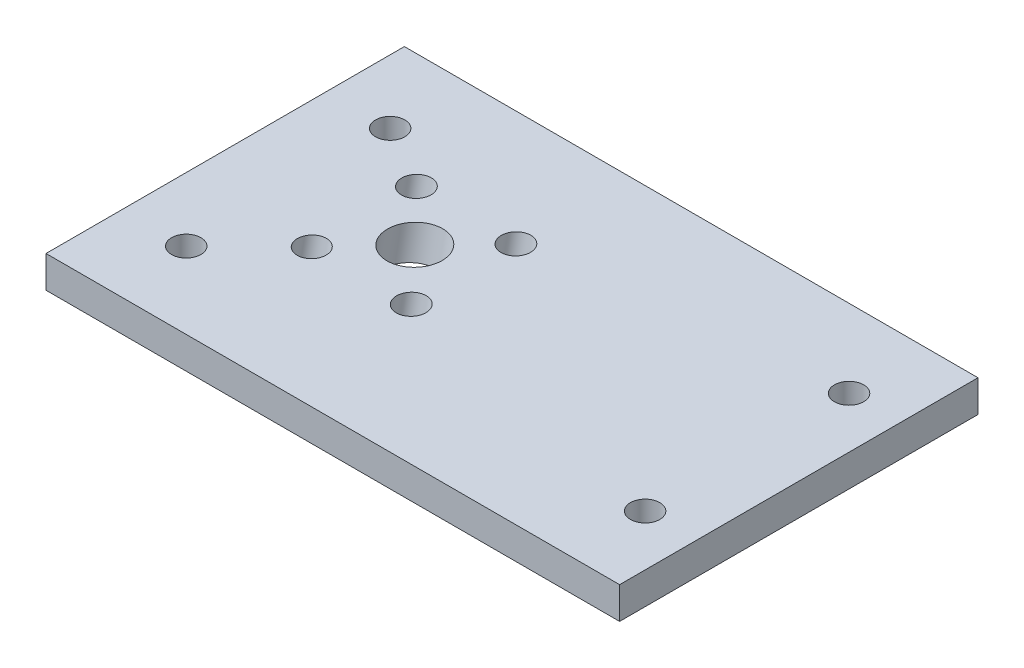
ISO-10303-21;
HEADER;
FILE_DESCRIPTION(('STEP AP214'),'2;1');
FILE_NAME('part.step','',(''),(''),'','','');
FILE_SCHEMA(('AUTOMOTIVE_DESIGN { 1 0 10303 214 1 1 1 1 }'));
ENDSEC;
DATA;
#1=APPLICATION_CONTEXT('core data for automotive mechanical design processes');
#2=APPLICATION_PROTOCOL_DEFINITION('international standard','automotive_design',2000,#1);
#3=PRODUCT_CONTEXT('',#1,'mechanical');
#4=PRODUCT('Part','Part','',(#3));
#5=PRODUCT_RELATED_PRODUCT_CATEGORY('part','',(#4));
#6=PRODUCT_DEFINITION_FORMATION('','',#4);
#7=PRODUCT_DEFINITION_CONTEXT('part definition',#1,'design');
#8=PRODUCT_DEFINITION('design','',#6,#7);
#9=PRODUCT_DEFINITION_SHAPE('','',#8);
#10=(LENGTH_UNIT() NAMED_UNIT(*) SI_UNIT(.MILLI.,.METRE.));
#11=(NAMED_UNIT(*) PLANE_ANGLE_UNIT() SI_UNIT($,.RADIAN.));
#12=(NAMED_UNIT(*) SI_UNIT($,.STERADIAN.) SOLID_ANGLE_UNIT());
#13=UNCERTAINTY_MEASURE_WITH_UNIT(LENGTH_MEASURE(1.E-05),#10,'distance_accuracy_value','');
#14=(GEOMETRIC_REPRESENTATION_CONTEXT(3) GLOBAL_UNCERTAINTY_ASSIGNED_CONTEXT((#13)) GLOBAL_UNIT_ASSIGNED_CONTEXT((#10,
#11,#12)) REPRESENTATION_CONTEXT('',''));
#15=CARTESIAN_POINT('',(0.,0.,0.));
#16=DIRECTION('',(0.,0.,1.));
#17=DIRECTION('',(1.,0.,0.));
#18=AXIS2_PLACEMENT_3D('',#15,#16,#17);
#19=CARTESIAN_POINT('',(0.,5.,0.));
#20=DIRECTION('',(1.,0.,0.));
#21=DIRECTION('',(0.,0.,-1.));
#22=AXIS2_PLACEMENT_3D('',#19,#20,#21);
#23=PLANE('',#22);
#24=DIRECTION('',(0.,0.,1.));
#25=VECTOR('',#24,1.);
#26=CARTESIAN_POINT('',(0.,0.,0.));
#27=LINE('',#26,#25);
#28=CARTESIAN_POINT('',(0.,0.,-56.23));
#29=VERTEX_POINT('',#28);
#30=CARTESIAN_POINT('',(0.,0.,0.));
#31=VERTEX_POINT('',#30);
#32=EDGE_CURVE('E99',#29,#31,#27,.T.);
#33=ORIENTED_EDGE('',*,*,#32,.T.);
#34=DIRECTION('',(0.,-1.,0.));
#35=VECTOR('',#34,1.);
#36=CARTESIAN_POINT('',(0.,5.,0.));
#37=LINE('',#36,#35);
#38=CARTESIAN_POINT('',(0.,5.,0.));
#39=VERTEX_POINT('',#38);
#40=EDGE_CURVE('E11',#39,#31,#37,.T.);
#41=ORIENTED_EDGE('',*,*,#40,.F.);
#42=DIRECTION('',(0.,0.,1.));
#43=VECTOR('',#42,1.);
#44=CARTESIAN_POINT('',(0.,5.,0.));
#45=LINE('',#44,#43);
#46=CARTESIAN_POINT('',(0.,5.,-56.23));
#47=VERTEX_POINT('',#46);
#48=EDGE_CURVE('E86',#47,#39,#45,.T.);
#49=ORIENTED_EDGE('',*,*,#48,.F.);
#50=DIRECTION('',(0.,-1.,0.));
#51=VECTOR('',#50,1.);
#52=CARTESIAN_POINT('',(0.,5.,-56.23));
#53=LINE('',#52,#51);
#54=EDGE_CURVE('E95',#47,#29,#53,.T.);
#55=ORIENTED_EDGE('',*,*,#54,.T.);
#56=EDGE_LOOP('',(#33,#41,#49,#55));
#57=FACE_BOUND('',#56,.T.);
#58=ADVANCED_FACE('F33',(#57),#23,.F.);
#59=CARTESIAN_POINT('',(0.,5.,0.));
#60=DIRECTION('',(0.,0.,-1.));
#61=DIRECTION('',(-1.,0.,0.));
#62=AXIS2_PLACEMENT_3D('',#59,#60,#61);
#63=PLANE('',#62);
#64=DIRECTION('',(1.,0.,0.));
#65=VECTOR('',#64,1.);
#66=CARTESIAN_POINT('',(0.,0.,0.));
#67=LINE('',#66,#65);
#68=CARTESIAN_POINT('',(90.,0.,0.));
#69=VERTEX_POINT('',#68);
#70=EDGE_CURVE('E90',#31,#69,#67,.T.);
#71=ORIENTED_EDGE('',*,*,#70,.T.);
#72=DIRECTION('',(0.,-1.,0.));
#73=VECTOR('',#72,1.);
#74=CARTESIAN_POINT('',(90.,5.,0.));
#75=LINE('',#74,#73);
#76=CARTESIAN_POINT('',(90.,5.,0.));
#77=VERTEX_POINT('',#76);
#78=EDGE_CURVE('E42',#77,#69,#75,.T.);
#79=ORIENTED_EDGE('',*,*,#78,.F.);
#80=DIRECTION('',(1.,0.,0.));
#81=VECTOR('',#80,1.);
#82=CARTESIAN_POINT('',(0.,5.,0.));
#83=LINE('',#82,#81);
#84=EDGE_CURVE('E81',#39,#77,#83,.T.);
#85=ORIENTED_EDGE('',*,*,#84,.F.);
#86=ORIENTED_EDGE('',*,*,#40,.T.);
#87=EDGE_LOOP('',(#71,#79,#85,#86));
#88=FACE_BOUND('',#87,.T.);
#89=ADVANCED_FACE('F89',(#88),#63,.F.);
#90=CARTESIAN_POINT('',(90.,5.,0.));
#91=DIRECTION('',(-1.,0.,0.));
#92=DIRECTION('',(0.,0.,1.));
#93=AXIS2_PLACEMENT_3D('',#90,#91,#92);
#94=PLANE('',#93);
#95=DIRECTION('',(0.,0.,-1.));
#96=VECTOR('',#95,1.);
#97=CARTESIAN_POINT('',(90.,0.,0.));
#98=LINE('',#97,#96);
#99=CARTESIAN_POINT('',(90.,0.,-56.23));
#100=VERTEX_POINT('',#99);
#101=EDGE_CURVE('E68',#69,#100,#98,.T.);
#102=ORIENTED_EDGE('',*,*,#101,.T.);
#103=DIRECTION('',(0.,-1.,0.));
#104=VECTOR('',#103,1.);
#105=CARTESIAN_POINT('',(90.,5.,-56.23));
#106=LINE('',#105,#104);
#107=CARTESIAN_POINT('',(90.,5.,-56.23));
#108=VERTEX_POINT('',#107);
#109=EDGE_CURVE('E91',#108,#100,#106,.T.);
#110=ORIENTED_EDGE('',*,*,#109,.F.);
#111=DIRECTION('',(0.,0.,-1.));
#112=VECTOR('',#111,1.);
#113=CARTESIAN_POINT('',(90.,5.,0.));
#114=LINE('',#113,#112);
#115=EDGE_CURVE('E84',#77,#108,#114,.T.);
#116=ORIENTED_EDGE('',*,*,#115,.F.);
#117=ORIENTED_EDGE('',*,*,#78,.T.);
#118=EDGE_LOOP('',(#102,#110,#116,#117));
#119=FACE_BOUND('',#118,.T.);
#120=ADVANCED_FACE('F93',(#119),#94,.F.);
#121=CARTESIAN_POINT('',(0.,5.,-56.23));
#122=DIRECTION('',(0.,0.,1.));
#123=DIRECTION('',(1.,0.,0.));
#124=AXIS2_PLACEMENT_3D('',#121,#122,#123);
#125=PLANE('',#124);
#126=DIRECTION('',(-1.,0.,0.));
#127=VECTOR('',#126,1.);
#128=CARTESIAN_POINT('',(0.,0.,-56.23));
#129=LINE('',#128,#127);
#130=EDGE_CURVE('E74',#100,#29,#129,.T.);
#131=ORIENTED_EDGE('',*,*,#130,.T.);
#132=ORIENTED_EDGE('',*,*,#54,.F.);
#133=DIRECTION('',(-1.,0.,0.));
#134=VECTOR('',#133,1.);
#135=CARTESIAN_POINT('',(0.,5.,-56.23));
#136=LINE('',#135,#134);
#137=EDGE_CURVE('E51',#108,#47,#136,.T.);
#138=ORIENTED_EDGE('',*,*,#137,.F.);
#139=ORIENTED_EDGE('',*,*,#109,.T.);
#140=EDGE_LOOP('',(#131,#132,#138,#139));
#141=FACE_BOUND('',#140,.T.);
#142=ADVANCED_FACE('F164',(#141),#125,.F.);
#143=CARTESIAN_POINT('',(0.,5.,0.));
#144=DIRECTION('',(0.,-1.,0.));
#145=DIRECTION('',(0.,0.,-1.));
#146=AXIS2_PLACEMENT_3D('',#143,#144,#145);
#147=PLANE('',#146);
#148=CARTESIAN_POINT('',(27.7526194802546,5.,-30.1125349533038));
#149=DIRECTION('',(0.,-1.,0.));
#150=DIRECTION('',(0.,0.,-1.));
#151=AXIS2_PLACEMENT_3D('',#148,#149,#150);
#152=ELLIPSE('',#151,4.36752722835537,4.28728345180147);
#153=CARTESIAN_POINT('',(27.7526194802546,5.,-34.4800621816592));
#154=VERTEX_POINT('',#153);
#155=EDGE_CURVE('E147',#154,#154,#152,.T.);
#156=ORIENTED_EDGE('',*,*,#155,.T.);
#157=EDGE_LOOP('',(#156));
#158=FACE_BOUND('',#157,.T.);
#159=CARTESIAN_POINT('',(19.9454822574572,5.,-38.1677608669548));
#160=DIRECTION('',(0.,-1.,0.));
#161=DIRECTION('',(0.,0.,-1.));
#162=AXIS2_PLACEMENT_3D('',#159,#160,#161);
#163=ELLIPSE('',#162,2.34304839839699,2.3);
#164=CARTESIAN_POINT('',(19.9454822574572,5.,-40.5108092653518));
#165=VERTEX_POINT('',#164);
#166=EDGE_CURVE('E135',#165,#165,#163,.T.);
#167=ORIENTED_EDGE('',*,*,#166,.T.);
#168=EDGE_LOOP('',(#167));
#169=FACE_BOUND('',#168,.T.);
#170=CARTESIAN_POINT('',(35.5597567030519,5.,-38.1677608669548));
#171=DIRECTION('',(0.,-1.,0.));
#172=DIRECTION('',(0.,0.,-1.));
#173=AXIS2_PLACEMENT_3D('',#170,#171,#172);
#174=ELLIPSE('',#173,2.343048398397,2.3);
#175=CARTESIAN_POINT('',(35.5597567030519,5.,-40.5108092653518));
#176=VERTEX_POINT('',#175);
#177=EDGE_CURVE('E132',#176,#176,#174,.T.);
#178=ORIENTED_EDGE('',*,*,#177,.T.);
#179=EDGE_LOOP('',(#178));
#180=FACE_BOUND('',#179,.T.);
#181=CARTESIAN_POINT('',(35.5597567030519,5.,-21.7514143847097));
#182=DIRECTION('',(0.,-1.,0.));
#183=DIRECTION('',(0.,0.,-1.));
#184=AXIS2_PLACEMENT_3D('',#181,#182,#183);
#185=ELLIPSE('',#184,2.343048398397,2.30000000000001);
#186=CARTESIAN_POINT('',(35.5597567030519,5.,-24.0944627831067));
#187=VERTEX_POINT('',#186);
#188=EDGE_CURVE('E129',#187,#187,#185,.T.);
#189=ORIENTED_EDGE('',*,*,#188,.T.);
#190=EDGE_LOOP('',(#189));
#191=FACE_BOUND('',#190,.T.);
#192=CARTESIAN_POINT('',(19.9454822574572,5.,-21.7514143847097));
#193=DIRECTION('',(0.,-1.,0.));
#194=DIRECTION('',(0.,0.,-1.));
#195=AXIS2_PLACEMENT_3D('',#192,#193,#194);
#196=ELLIPSE('',#195,2.3,2.25774252192963);
#197=CARTESIAN_POINT('',(19.9454822574572,5.,-24.0514143847097));
#198=VERTEX_POINT('',#197);
#199=EDGE_CURVE('E125',#198,#198,#196,.T.);
#200=ORIENTED_EDGE('',*,*,#199,.T.);
#201=EDGE_LOOP('',(#200));
#202=FACE_BOUND('',#201,.T.);
#203=CARTESIAN_POINT('',(82.0000000000904,5.,-44.0000000000535));
#204=DIRECTION('',(0.,1.,0.));
#205=DIRECTION('',(0.,0.,1.));
#206=AXIS2_PLACEMENT_3D('',#203,#204,#205);
#207=CIRCLE('',#206,2.29999999990055);
#208=CARTESIAN_POINT('',(82.0000000000904,5.,-41.7000000001529));
#209=VERTEX_POINT('',#208);
#210=EDGE_CURVE('E118',#209,#209,#207,.T.);
#211=ORIENTED_EDGE('',*,*,#210,.F.);
#212=EDGE_LOOP('',(#211));
#213=FACE_BOUND('',#212,.T.);
#214=CARTESIAN_POINT('',(10.0000000000904,5.,-44.0000000000537));
#215=DIRECTION('',(0.,1.,0.));
#216=DIRECTION('',(0.,0.,1.));
#217=AXIS2_PLACEMENT_3D('',#214,#215,#216);
#218=CIRCLE('',#217,2.29999999990054);
#219=CARTESIAN_POINT('',(10.0000000000904,5.,-41.7000000001532));
#220=VERTEX_POINT('',#219);
#221=EDGE_CURVE('E150',#220,#220,#218,.T.);
#222=ORIENTED_EDGE('',*,*,#221,.F.);
#223=EDGE_LOOP('',(#222));
#224=FACE_BOUND('',#223,.T.);
#225=CARTESIAN_POINT('',(82.0000000000023,5.,-12.0000000000011));
#226=DIRECTION('',(0.,1.,0.));
#227=DIRECTION('',(0.,0.,1.));
#228=AXIS2_PLACEMENT_3D('',#225,#226,#227);
#229=CIRCLE('',#228,2.29999999999999);
#230=CARTESIAN_POINT('',(82.0000000000023,5.,-9.70000000000109));
#231=VERTEX_POINT('',#230);
#232=EDGE_CURVE('E111',#231,#231,#229,.T.);
#233=ORIENTED_EDGE('',*,*,#232,.F.);
#234=EDGE_LOOP('',(#233));
#235=FACE_BOUND('',#234,.T.);
#236=CARTESIAN_POINT('',(10.0000000000023,5.,-12.0000000000013));
#237=DIRECTION('',(0.,1.,0.));
#238=DIRECTION('',(0.,0.,1.));
#239=AXIS2_PLACEMENT_3D('',#236,#237,#238);
#240=CIRCLE('',#239,2.3);
#241=CARTESIAN_POINT('',(10.0000000000023,5.,-9.70000000000134));
#242=VERTEX_POINT('',#241);
#243=EDGE_CURVE('E121',#242,#242,#240,.T.);
#244=ORIENTED_EDGE('',*,*,#243,.F.);
#245=EDGE_LOOP('',(#244));
#246=FACE_BOUND('',#245,.T.);
#247=ORIENTED_EDGE('',*,*,#48,.T.);
#248=ORIENTED_EDGE('',*,*,#84,.T.);
#249=ORIENTED_EDGE('',*,*,#115,.T.);
#250=ORIENTED_EDGE('',*,*,#137,.T.);
#251=EDGE_LOOP('',(#247,#248,#249,#250));
#252=FACE_BOUND('',#251,.T.);
#253=ADVANCED_FACE('F82',(#158,#169,#180,#191,#202,#213,#224,#235,#246,#252),#147,.F.);
#254=CARTESIAN_POINT('',(0.,0.,0.));
#255=DIRECTION('',(0.,-1.,0.));
#256=DIRECTION('',(0.,0.,-1.));
#257=AXIS2_PLACEMENT_3D('',#254,#255,#256);
#258=PLANE('',#257);
#259=CARTESIAN_POINT('',(27.7526194802546,0.,-29.1406334076152));
#260=DIRECTION('',(0.,-1.,0.));
#261=DIRECTION('',(0.,0.,-1.));
#262=AXIS2_PLACEMENT_3D('',#259,#260,#261);
#263=ELLIPSE('',#262,4.36752722835537,4.28728345180147);
#264=CARTESIAN_POINT('',(27.7526194802546,0.,-33.5081606359706));
#265=VERTEX_POINT('',#264);
#266=EDGE_CURVE('E36',#265,#265,#263,.T.);
#267=ORIENTED_EDGE('',*,*,#266,.F.);
#268=EDGE_LOOP('',(#267));
#269=FACE_BOUND('',#268,.T.);
#270=CARTESIAN_POINT('',(19.9454822574572,0.,-37.1958593212662));
#271=DIRECTION('',(0.,-1.,0.));
#272=DIRECTION('',(0.,0.,-1.));
#273=AXIS2_PLACEMENT_3D('',#270,#271,#272);
#274=ELLIPSE('',#273,2.34304839839699,2.3);
#275=CARTESIAN_POINT('',(19.9454822574572,0.,-39.5389077196632));
#276=VERTEX_POINT('',#275);
#277=EDGE_CURVE('E133',#276,#276,#274,.T.);
#278=ORIENTED_EDGE('',*,*,#277,.F.);
#279=EDGE_LOOP('',(#278));
#280=FACE_BOUND('',#279,.T.);
#281=CARTESIAN_POINT('',(35.5597567030519,0.,-37.1958593212662));
#282=DIRECTION('',(0.,-1.,0.));
#283=DIRECTION('',(0.,0.,-1.));
#284=AXIS2_PLACEMENT_3D('',#281,#282,#283);
#285=ELLIPSE('',#284,2.343048398397,2.3);
#286=CARTESIAN_POINT('',(35.5597567030519,0.,-39.5389077196632));
#287=VERTEX_POINT('',#286);
#288=EDGE_CURVE('E130',#287,#287,#285,.T.);
#289=ORIENTED_EDGE('',*,*,#288,.F.);
#290=EDGE_LOOP('',(#289));
#291=FACE_BOUND('',#290,.T.);
#292=CARTESIAN_POINT('',(35.5597567030519,0.,-20.7795128390211));
#293=DIRECTION('',(0.,-1.,0.));
#294=DIRECTION('',(0.,0.,-1.));
#295=AXIS2_PLACEMENT_3D('',#292,#293,#294);
#296=ELLIPSE('',#295,2.343048398397,2.30000000000001);
#297=CARTESIAN_POINT('',(35.5597567030519,0.,-23.1225612374181));
#298=VERTEX_POINT('',#297);
#299=EDGE_CURVE('E126',#298,#298,#296,.T.);
#300=ORIENTED_EDGE('',*,*,#299,.F.);
#301=EDGE_LOOP('',(#300));
#302=FACE_BOUND('',#301,.T.);
#303=CARTESIAN_POINT('',(19.9454822574572,0.,-20.7795128390211));
#304=DIRECTION('',(0.,-1.,0.));
#305=DIRECTION('',(0.,0.,-1.));
#306=AXIS2_PLACEMENT_3D('',#303,#304,#305);
#307=ELLIPSE('',#306,2.3,2.25774252192963);
#308=CARTESIAN_POINT('',(19.9454822574572,0.,-23.0795128390211));
#309=VERTEX_POINT('',#308);
#310=EDGE_CURVE('E122',#309,#309,#307,.T.);
#311=ORIENTED_EDGE('',*,*,#310,.F.);
#312=EDGE_LOOP('',(#311));
#313=FACE_BOUND('',#312,.T.);
#314=CARTESIAN_POINT('',(82.0000000000904,0.,-44.0000000000535));
#315=DIRECTION('',(0.,-1.,0.));
#316=DIRECTION('',(0.,0.,-1.));
#317=AXIS2_PLACEMENT_3D('',#314,#315,#316);
#318=CIRCLE('',#317,2.29999999990055);
#319=CARTESIAN_POINT('',(82.0000000000904,0.,-41.7000000001529));
#320=VERTEX_POINT('',#319);
#321=EDGE_CURVE('E117',#320,#320,#318,.T.);
#322=ORIENTED_EDGE('',*,*,#321,.F.);
#323=EDGE_LOOP('',(#322));
#324=FACE_BOUND('',#323,.T.);
#325=CARTESIAN_POINT('',(10.0000000000904,0.,-44.0000000000537));
#326=DIRECTION('',(0.,-1.,0.));
#327=DIRECTION('',(0.,0.,-1.));
#328=AXIS2_PLACEMENT_3D('',#325,#326,#327);
#329=CIRCLE('',#328,2.29999999990054);
#330=CARTESIAN_POINT('',(10.0000000000904,0.,-41.7000000001532));
#331=VERTEX_POINT('',#330);
#332=EDGE_CURVE('E114',#331,#331,#329,.T.);
#333=ORIENTED_EDGE('',*,*,#332,.F.);
#334=EDGE_LOOP('',(#333));
#335=FACE_BOUND('',#334,.T.);
#336=CARTESIAN_POINT('',(82.0000000000023,0.,-12.0000000000011));
#337=DIRECTION('',(0.,-1.,0.));
#338=DIRECTION('',(0.,0.,-1.));
#339=AXIS2_PLACEMENT_3D('',#336,#337,#338);
#340=CIRCLE('',#339,2.29999999999999);
#341=CARTESIAN_POINT('',(82.0000000000023,0.,-9.70000000000109));
#342=VERTEX_POINT('',#341);
#343=EDGE_CURVE('E102',#342,#342,#340,.T.);
#344=ORIENTED_EDGE('',*,*,#343,.F.);
#345=EDGE_LOOP('',(#344));
#346=FACE_BOUND('',#345,.T.);
#347=CARTESIAN_POINT('',(10.0000000000023,0.,-12.0000000000013));
#348=DIRECTION('',(0.,-1.,0.));
#349=DIRECTION('',(0.,0.,-1.));
#350=AXIS2_PLACEMENT_3D('',#347,#348,#349);
#351=CIRCLE('',#350,2.3);
#352=CARTESIAN_POINT('',(10.0000000000023,0.,-9.70000000000134));
#353=VERTEX_POINT('',#352);
#354=EDGE_CURVE('E108',#353,#353,#351,.T.);
#355=ORIENTED_EDGE('',*,*,#354,.F.);
#356=EDGE_LOOP('',(#355));
#357=FACE_BOUND('',#356,.T.);
#358=ORIENTED_EDGE('',*,*,#32,.F.);
#359=ORIENTED_EDGE('',*,*,#130,.F.);
#360=ORIENTED_EDGE('',*,*,#101,.F.);
#361=ORIENTED_EDGE('',*,*,#70,.F.);
#362=EDGE_LOOP('',(#358,#359,#360,#361));
#363=FACE_BOUND('',#362,.T.);
#364=ADVANCED_FACE('F163',(#269,#280,#291,#302,#313,#324,#335,#346,#357,#363),#258,.T.);
#365=CARTESIAN_POINT('',(10.0000000000023,-10.,-12.0000000000013));
#366=DIRECTION('',(0.,1.,0.));
#367=DIRECTION('',(0.,0.,1.));
#368=AXIS2_PLACEMENT_3D('',#365,#366,#367);
#369=CYLINDRICAL_SURFACE('',#368,2.3);
#370=CARTESIAN_POINT('',(10.0000000000023,0.,-9.70000000000134));
#371=CARTESIAN_POINT('',(10.0000000000023,0.0520833333333351,-9.70000000000134));
#372=CARTESIAN_POINT('',(10.0000000000023,0.104166666666669,-9.70000000000134));
#373=CARTESIAN_POINT('',(10.0000000000023,0.208333333333335,-9.70000000000134));
#374=CARTESIAN_POINT('',(10.0000000000023,0.260416666666669,-9.70000000000134));
#375=CARTESIAN_POINT('',(10.0000000000023,0.364583333333335,-9.70000000000134));
#376=CARTESIAN_POINT('',(10.0000000000023,0.416666666666669,-9.70000000000134));
#377=CARTESIAN_POINT('',(10.0000000000023,0.520833333333335,-9.70000000000134));
#378=CARTESIAN_POINT('',(10.0000000000023,0.572916666666669,-9.70000000000134));
#379=CARTESIAN_POINT('',(10.0000000000023,0.677083333333335,-9.70000000000134));
#380=CARTESIAN_POINT('',(10.0000000000023,0.729166666666668,-9.70000000000134));
#381=CARTESIAN_POINT('',(10.0000000000023,0.833333333333334,-9.70000000000134));
#382=CARTESIAN_POINT('',(10.0000000000023,0.885416666666668,-9.70000000000134));
#383=CARTESIAN_POINT('',(10.0000000000023,0.989583333333334,-9.70000000000134));
#384=CARTESIAN_POINT('',(10.0000000000023,1.04166666666667,-9.70000000000134));
#385=CARTESIAN_POINT('',(10.0000000000023,1.14583333333333,-9.70000000000134));
#386=CARTESIAN_POINT('',(10.0000000000023,1.19791666666667,-9.70000000000134));
#387=CARTESIAN_POINT('',(10.0000000000023,1.30208333333333,-9.70000000000134));
#388=CARTESIAN_POINT('',(10.0000000000023,1.35416666666667,-9.70000000000134));
#389=CARTESIAN_POINT('',(10.0000000000023,1.45833333333333,-9.70000000000134));
#390=CARTESIAN_POINT('',(10.0000000000023,1.51041666666667,-9.70000000000134));
#391=CARTESIAN_POINT('',(10.0000000000023,1.61458333333333,-9.70000000000134));
#392=CARTESIAN_POINT('',(10.0000000000023,1.66666666666667,-9.70000000000134));
#393=CARTESIAN_POINT('',(10.0000000000023,1.77083333333333,-9.70000000000134));
#394=CARTESIAN_POINT('',(10.0000000000023,1.82291666666667,-9.70000000000134));
#395=CARTESIAN_POINT('',(10.0000000000023,1.92708333333333,-9.70000000000134));
#396=CARTESIAN_POINT('',(10.0000000000023,1.97916666666667,-9.70000000000134));
#397=CARTESIAN_POINT('',(10.0000000000023,2.08333333333333,-9.70000000000134));
#398=CARTESIAN_POINT('',(10.0000000000023,2.13541666666667,-9.70000000000134));
#399=CARTESIAN_POINT('',(10.0000000000023,2.23958333333333,-9.70000000000134));
#400=CARTESIAN_POINT('',(10.0000000000023,2.29166666666667,-9.70000000000134));
#401=CARTESIAN_POINT('',(10.0000000000023,2.39583333333333,-9.70000000000134));
#402=CARTESIAN_POINT('',(10.0000000000023,2.44791666666667,-9.70000000000134));
#403=CARTESIAN_POINT('',(10.0000000000023,2.55208333333333,-9.70000000000134));
#404=CARTESIAN_POINT('',(10.0000000000023,2.60416666666667,-9.70000000000134));
#405=CARTESIAN_POINT('',(10.0000000000023,2.70833333333333,-9.70000000000134));
#406=CARTESIAN_POINT('',(10.0000000000023,2.76041666666667,-9.70000000000134));
#407=CARTESIAN_POINT('',(10.0000000000023,2.86458333333333,-9.70000000000134));
#408=CARTESIAN_POINT('',(10.0000000000023,2.91666666666667,-9.70000000000134));
#409=CARTESIAN_POINT('',(10.0000000000023,3.02083333333333,-9.70000000000134));
#410=CARTESIAN_POINT('',(10.0000000000023,3.07291666666667,-9.70000000000134));
#411=CARTESIAN_POINT('',(10.0000000000023,3.17708333333333,-9.70000000000134));
#412=CARTESIAN_POINT('',(10.0000000000023,3.22916666666667,-9.70000000000134));
#413=CARTESIAN_POINT('',(10.0000000000023,3.33333333333333,-9.70000000000134));
#414=CARTESIAN_POINT('',(10.0000000000023,3.38541666666667,-9.70000000000134));
#415=CARTESIAN_POINT('',(10.0000000000023,3.48958333333333,-9.70000000000134));
#416=CARTESIAN_POINT('',(10.0000000000023,3.54166666666667,-9.70000000000134));
#417=CARTESIAN_POINT('',(10.0000000000023,3.64583333333333,-9.70000000000134));
#418=CARTESIAN_POINT('',(10.0000000000023,3.69791666666667,-9.70000000000134));
#419=CARTESIAN_POINT('',(10.0000000000023,3.80208333333333,-9.70000000000134));
#420=CARTESIAN_POINT('',(10.0000000000023,3.85416666666667,-9.70000000000134));
#421=CARTESIAN_POINT('',(10.0000000000023,3.95833333333333,-9.70000000000134));
#422=CARTESIAN_POINT('',(10.0000000000023,4.01041666666667,-9.70000000000134));
#423=CARTESIAN_POINT('',(10.0000000000023,4.11458333333333,-9.70000000000134));
#424=CARTESIAN_POINT('',(10.0000000000023,4.16666666666667,-9.70000000000134));
#425=CARTESIAN_POINT('',(10.0000000000023,4.27083333333333,-9.70000000000134));
#426=CARTESIAN_POINT('',(10.0000000000023,4.32291666666667,-9.70000000000134));
#427=CARTESIAN_POINT('',(10.0000000000023,4.42708333333333,-9.70000000000134));
#428=CARTESIAN_POINT('',(10.0000000000023,4.47916666666667,-9.70000000000134));
#429=CARTESIAN_POINT('',(10.0000000000023,4.58333333333333,-9.70000000000134));
#430=CARTESIAN_POINT('',(10.0000000000023,4.63541666666667,-9.70000000000134));
#431=CARTESIAN_POINT('',(10.0000000000023,4.73958333333333,-9.70000000000134));
#432=CARTESIAN_POINT('',(10.0000000000023,4.79166666666667,-9.70000000000134));
#433=CARTESIAN_POINT('',(10.0000000000023,4.89583333333333,-9.70000000000134));
#434=CARTESIAN_POINT('',(10.0000000000023,4.94791666666667,-9.70000000000134));
#435=CARTESIAN_POINT('',(10.0000000000023,5.,-9.70000000000134));
#436=B_SPLINE_CURVE_WITH_KNOTS('',3,(#370,#371,#372,#373,#374,#375,#376,#377,#378,#379,#380,
#381,#382,#383,#384,#385,#386,#387,#388,#389,#390,#391,#392,#393,#394,#395,#396,#397,#398,#399,
#400,#401,#402,#403,#404,#405,#406,#407,#408,#409,#410,#411,#412,#413,#414,#415,#416,#417,#418,
#419,#420,#421,#422,#423,#424,#425,#426,#427,#428,#429,#430,#431,#432,#433,#434,#435),
.UNSPECIFIED.,.F.,.F.,(4,2,2,2,2,2,2,2,2,2,2,2,2,2,2,2,2,2,2,2,2,2,2,2,2,2,2,2,2,2,2,2,4),(0.,
0.15625,0.3125,0.46875,0.625000000000001,0.781249999999999,0.937499999999999,1.09375,1.25,
1.40625,1.5625,1.71875,1.875,2.03125,2.1875,2.34375,2.5,2.65625,2.8125,2.96875,3.125,3.28125,
3.4375,3.59375,3.75,3.90625,4.0625,4.21875,4.375,4.53125,4.6875,4.84375,5.),.UNSPECIFIED.);
#437=EDGE_CURVE('BSEAM160',#353,#242,#436,.T.);
#438=ORIENTED_EDGE('',*,*,#354,.T.);
#439=ORIENTED_EDGE('',*,*,#243,.T.);
#440=ORIENTED_EDGE('',*,*,#437,.T.);
#441=ORIENTED_EDGE('',*,*,#437,.F.);
#442=EDGE_LOOP('',(#438,#440,#439,#441));
#443=FACE_BOUND('',#442,.T.);
#444=ADVANCED_FACE('F160',(#443),#369,.F.);
#445=CARTESIAN_POINT('',(82.0000000000023,-10.,-12.0000000000011));
#446=DIRECTION('',(0.,1.,0.));
#447=DIRECTION('',(0.,0.,1.));
#448=AXIS2_PLACEMENT_3D('',#445,#446,#447);
#449=CYLINDRICAL_SURFACE('',#448,2.29999999999999);
#450=CARTESIAN_POINT('',(82.0000000000023,0.,-9.70000000000109));
#451=CARTESIAN_POINT('',(82.0000000000023,0.0520833333333351,-9.70000000000109));
#452=CARTESIAN_POINT('',(82.0000000000023,0.104166666666669,-9.70000000000109));
#453=CARTESIAN_POINT('',(82.0000000000023,0.208333333333335,-9.70000000000109));
#454=CARTESIAN_POINT('',(82.0000000000023,0.260416666666669,-9.70000000000109));
#455=CARTESIAN_POINT('',(82.0000000000023,0.364583333333335,-9.70000000000109));
#456=CARTESIAN_POINT('',(82.0000000000023,0.416666666666669,-9.70000000000109));
#457=CARTESIAN_POINT('',(82.0000000000023,0.520833333333335,-9.70000000000109));
#458=CARTESIAN_POINT('',(82.0000000000023,0.572916666666669,-9.70000000000109));
#459=CARTESIAN_POINT('',(82.0000000000023,0.677083333333335,-9.70000000000109));
#460=CARTESIAN_POINT('',(82.0000000000023,0.729166666666668,-9.70000000000109));
#461=CARTESIAN_POINT('',(82.0000000000023,0.833333333333334,-9.70000000000109));
#462=CARTESIAN_POINT('',(82.0000000000023,0.885416666666668,-9.70000000000109));
#463=CARTESIAN_POINT('',(82.0000000000023,0.989583333333334,-9.70000000000109));
#464=CARTESIAN_POINT('',(82.0000000000023,1.04166666666667,-9.70000000000109));
#465=CARTESIAN_POINT('',(82.0000000000023,1.14583333333333,-9.70000000000109));
#466=CARTESIAN_POINT('',(82.0000000000023,1.19791666666667,-9.70000000000109));
#467=CARTESIAN_POINT('',(82.0000000000023,1.30208333333333,-9.70000000000109));
#468=CARTESIAN_POINT('',(82.0000000000023,1.35416666666667,-9.70000000000109));
#469=CARTESIAN_POINT('',(82.0000000000023,1.45833333333333,-9.70000000000109));
#470=CARTESIAN_POINT('',(82.0000000000023,1.51041666666667,-9.70000000000109));
#471=CARTESIAN_POINT('',(82.0000000000023,1.61458333333333,-9.70000000000109));
#472=CARTESIAN_POINT('',(82.0000000000023,1.66666666666667,-9.70000000000109));
#473=CARTESIAN_POINT('',(82.0000000000023,1.77083333333333,-9.70000000000109));
#474=CARTESIAN_POINT('',(82.0000000000023,1.82291666666667,-9.70000000000109));
#475=CARTESIAN_POINT('',(82.0000000000023,1.92708333333333,-9.70000000000109));
#476=CARTESIAN_POINT('',(82.0000000000023,1.97916666666667,-9.70000000000109));
#477=CARTESIAN_POINT('',(82.0000000000023,2.08333333333333,-9.70000000000109));
#478=CARTESIAN_POINT('',(82.0000000000023,2.13541666666667,-9.70000000000109));
#479=CARTESIAN_POINT('',(82.0000000000023,2.23958333333333,-9.70000000000109));
#480=CARTESIAN_POINT('',(82.0000000000023,2.29166666666667,-9.70000000000109));
#481=CARTESIAN_POINT('',(82.0000000000023,2.39583333333333,-9.70000000000109));
#482=CARTESIAN_POINT('',(82.0000000000023,2.44791666666667,-9.70000000000109));
#483=CARTESIAN_POINT('',(82.0000000000023,2.55208333333333,-9.70000000000109));
#484=CARTESIAN_POINT('',(82.0000000000023,2.60416666666667,-9.70000000000109));
#485=CARTESIAN_POINT('',(82.0000000000023,2.70833333333333,-9.70000000000109));
#486=CARTESIAN_POINT('',(82.0000000000023,2.76041666666667,-9.70000000000109));
#487=CARTESIAN_POINT('',(82.0000000000023,2.86458333333333,-9.70000000000109));
#488=CARTESIAN_POINT('',(82.0000000000023,2.91666666666667,-9.70000000000109));
#489=CARTESIAN_POINT('',(82.0000000000023,3.02083333333333,-9.70000000000109));
#490=CARTESIAN_POINT('',(82.0000000000023,3.07291666666667,-9.70000000000109));
#491=CARTESIAN_POINT('',(82.0000000000023,3.17708333333333,-9.70000000000109));
#492=CARTESIAN_POINT('',(82.0000000000023,3.22916666666667,-9.70000000000109));
#493=CARTESIAN_POINT('',(82.0000000000023,3.33333333333333,-9.70000000000109));
#494=CARTESIAN_POINT('',(82.0000000000023,3.38541666666667,-9.70000000000109));
#495=CARTESIAN_POINT('',(82.0000000000023,3.48958333333333,-9.70000000000109));
#496=CARTESIAN_POINT('',(82.0000000000023,3.54166666666667,-9.70000000000109));
#497=CARTESIAN_POINT('',(82.0000000000023,3.64583333333333,-9.70000000000109));
#498=CARTESIAN_POINT('',(82.0000000000023,3.69791666666667,-9.70000000000109));
#499=CARTESIAN_POINT('',(82.0000000000023,3.80208333333333,-9.70000000000109));
#500=CARTESIAN_POINT('',(82.0000000000023,3.85416666666667,-9.70000000000109));
#501=CARTESIAN_POINT('',(82.0000000000023,3.95833333333333,-9.70000000000109));
#502=CARTESIAN_POINT('',(82.0000000000023,4.01041666666667,-9.70000000000109));
#503=CARTESIAN_POINT('',(82.0000000000023,4.11458333333333,-9.70000000000109));
#504=CARTESIAN_POINT('',(82.0000000000023,4.16666666666667,-9.70000000000109));
#505=CARTESIAN_POINT('',(82.0000000000023,4.27083333333333,-9.70000000000109));
#506=CARTESIAN_POINT('',(82.0000000000023,4.32291666666667,-9.70000000000109));
#507=CARTESIAN_POINT('',(82.0000000000023,4.42708333333333,-9.70000000000109));
#508=CARTESIAN_POINT('',(82.0000000000023,4.47916666666667,-9.70000000000109));
#509=CARTESIAN_POINT('',(82.0000000000023,4.58333333333333,-9.70000000000109));
#510=CARTESIAN_POINT('',(82.0000000000023,4.63541666666667,-9.70000000000109));
#511=CARTESIAN_POINT('',(82.0000000000023,4.73958333333333,-9.70000000000109));
#512=CARTESIAN_POINT('',(82.0000000000023,4.79166666666667,-9.70000000000109));
#513=CARTESIAN_POINT('',(82.0000000000023,4.89583333333333,-9.70000000000109));
#514=CARTESIAN_POINT('',(82.0000000000023,4.94791666666667,-9.70000000000109));
#515=CARTESIAN_POINT('',(82.0000000000023,5.,-9.70000000000109));
#516=B_SPLINE_CURVE_WITH_KNOTS('',3,(#450,#451,#452,#453,#454,#455,#456,#457,#458,#459,#460,
#461,#462,#463,#464,#465,#466,#467,#468,#469,#470,#471,#472,#473,#474,#475,#476,#477,#478,#479,
#480,#481,#482,#483,#484,#485,#486,#487,#488,#489,#490,#491,#492,#493,#494,#495,#496,#497,#498,
#499,#500,#501,#502,#503,#504,#505,#506,#507,#508,#509,#510,#511,#512,#513,#514,#515),
.UNSPECIFIED.,.F.,.F.,(4,2,2,2,2,2,2,2,2,2,2,2,2,2,2,2,2,2,2,2,2,2,2,2,2,2,2,2,2,2,2,2,4),(0.,
0.15625,0.3125,0.46875,0.625000000000001,0.781249999999999,0.937499999999999,1.09375,1.25,
1.40625,1.5625,1.71875,1.875,2.03125,2.1875,2.34375,2.5,2.65625,2.8125,2.96875,3.125,3.28125,
3.4375,3.59375,3.75,3.90625,4.0625,4.21875,4.375,4.53125,4.6875,4.84375,5.),.UNSPECIFIED.);
#517=EDGE_CURVE('BSEAM212',#342,#231,#516,.T.);
#518=ORIENTED_EDGE('',*,*,#343,.T.);
#519=ORIENTED_EDGE('',*,*,#232,.T.);
#520=ORIENTED_EDGE('',*,*,#517,.T.);
#521=ORIENTED_EDGE('',*,*,#517,.F.);
#522=EDGE_LOOP('',(#518,#520,#519,#521));
#523=FACE_BOUND('',#522,.T.);
#524=ADVANCED_FACE('F212',(#523),#449,.F.);
#525=CARTESIAN_POINT('',(10.0000000000904,-40.,-44.0000000000537));
#526=DIRECTION('',(0.,1.,0.));
#527=DIRECTION('',(0.,0.,1.));
#528=AXIS2_PLACEMENT_3D('',#525,#526,#527);
#529=CYLINDRICAL_SURFACE('',#528,2.29999999990054);
#530=CARTESIAN_POINT('',(10.0000000000904,0.,-41.7000000001532));
#531=CARTESIAN_POINT('',(10.0000000000904,0.0520833333333392,-41.7000000001532));
#532=CARTESIAN_POINT('',(10.0000000000904,0.104166666666671,-41.7000000001532));
#533=CARTESIAN_POINT('',(10.0000000000904,0.208333333333338,-41.7000000001532));
#534=CARTESIAN_POINT('',(10.0000000000904,0.260416666666673,-41.7000000001532));
#535=CARTESIAN_POINT('',(10.0000000000904,0.364583333333339,-41.7000000001532));
#536=CARTESIAN_POINT('',(10.0000000000904,0.416666666666672,-41.7000000001532));
#537=CARTESIAN_POINT('',(10.0000000000904,0.520833333333338,-41.7000000001532));
#538=CARTESIAN_POINT('',(10.0000000000904,0.572916666666673,-41.7000000001532));
#539=CARTESIAN_POINT('',(10.0000000000904,0.67708333333334,-41.7000000001532));
#540=CARTESIAN_POINT('',(10.0000000000904,0.729166666666672,-41.7000000001532));
#541=CARTESIAN_POINT('',(10.0000000000904,0.833333333333339,-41.7000000001532));
#542=CARTESIAN_POINT('',(10.0000000000904,0.885416666666673,-41.7000000001532));
#543=CARTESIAN_POINT('',(10.0000000000904,0.98958333333334,-41.7000000001532));
#544=CARTESIAN_POINT('',(10.0000000000904,1.04166666666667,-41.7000000001532));
#545=CARTESIAN_POINT('',(10.0000000000904,1.14583333333334,-41.7000000001532));
#546=CARTESIAN_POINT('',(10.0000000000904,1.19791666666667,-41.7000000001532));
#547=CARTESIAN_POINT('',(10.0000000000904,1.30208333333334,-41.7000000001532));
#548=CARTESIAN_POINT('',(10.0000000000904,1.35416666666667,-41.7000000001532));
#549=CARTESIAN_POINT('',(10.0000000000904,1.45833333333334,-41.7000000001532));
#550=CARTESIAN_POINT('',(10.0000000000904,1.51041666666667,-41.7000000001532));
#551=CARTESIAN_POINT('',(10.0000000000904,1.61458333333334,-41.7000000001532));
#552=CARTESIAN_POINT('',(10.0000000000904,1.66666666666667,-41.7000000001532));
#553=CARTESIAN_POINT('',(10.0000000000904,1.77083333333334,-41.7000000001532));
#554=CARTESIAN_POINT('',(10.0000000000904,1.82291666666667,-41.7000000001532));
#555=CARTESIAN_POINT('',(10.0000000000904,1.92708333333334,-41.7000000001532));
#556=CARTESIAN_POINT('',(10.0000000000904,1.97916666666667,-41.7000000001532));
#557=CARTESIAN_POINT('',(10.0000000000904,2.08333333333334,-41.7000000001532));
#558=CARTESIAN_POINT('',(10.0000000000904,2.13541666666667,-41.7000000001532));
#559=CARTESIAN_POINT('',(10.0000000000904,2.23958333333334,-41.7000000001532));
#560=CARTESIAN_POINT('',(10.0000000000904,2.29166666666667,-41.7000000001532));
#561=CARTESIAN_POINT('',(10.0000000000904,2.39583333333334,-41.7000000001532));
#562=CARTESIAN_POINT('',(10.0000000000904,2.44791666666667,-41.7000000001532));
#563=CARTESIAN_POINT('',(10.0000000000904,2.55208333333333,-41.7000000001532));
#564=CARTESIAN_POINT('',(10.0000000000904,2.60416666666667,-41.7000000001532));
#565=CARTESIAN_POINT('',(10.0000000000904,2.70833333333333,-41.7000000001532));
#566=CARTESIAN_POINT('',(10.0000000000904,2.76041666666667,-41.7000000001532));
#567=CARTESIAN_POINT('',(10.0000000000904,2.86458333333333,-41.7000000001532));
#568=CARTESIAN_POINT('',(10.0000000000904,2.91666666666667,-41.7000000001532));
#569=CARTESIAN_POINT('',(10.0000000000904,3.02083333333333,-41.7000000001532));
#570=CARTESIAN_POINT('',(10.0000000000904,3.07291666666667,-41.7000000001532));
#571=CARTESIAN_POINT('',(10.0000000000904,3.17708333333334,-41.7000000001532));
#572=CARTESIAN_POINT('',(10.0000000000904,3.22916666666667,-41.7000000001532));
#573=CARTESIAN_POINT('',(10.0000000000904,3.33333333333333,-41.7000000001532));
#574=CARTESIAN_POINT('',(10.0000000000904,3.38541666666667,-41.7000000001532));
#575=CARTESIAN_POINT('',(10.0000000000904,3.48958333333334,-41.7000000001532));
#576=CARTESIAN_POINT('',(10.0000000000904,3.54166666666667,-41.7000000001532));
#577=CARTESIAN_POINT('',(10.0000000000904,3.64583333333333,-41.7000000001532));
#578=CARTESIAN_POINT('',(10.0000000000904,3.69791666666666,-41.7000000001532));
#579=CARTESIAN_POINT('',(10.0000000000904,3.80208333333333,-41.7000000001532));
#580=CARTESIAN_POINT('',(10.0000000000904,3.85416666666667,-41.7000000001532));
#581=CARTESIAN_POINT('',(10.0000000000904,3.95833333333333,-41.7000000001532));
#582=CARTESIAN_POINT('',(10.0000000000904,4.01041666666666,-41.7000000001532));
#583=CARTESIAN_POINT('',(10.0000000000904,4.11458333333333,-41.7000000001532));
#584=CARTESIAN_POINT('',(10.0000000000904,4.16666666666667,-41.7000000001532));
#585=CARTESIAN_POINT('',(10.0000000000904,4.27083333333333,-41.7000000001532));
#586=CARTESIAN_POINT('',(10.0000000000904,4.32291666666667,-41.7000000001532));
#587=CARTESIAN_POINT('',(10.0000000000904,4.42708333333333,-41.7000000001532));
#588=CARTESIAN_POINT('',(10.0000000000904,4.47916666666667,-41.7000000001532));
#589=CARTESIAN_POINT('',(10.0000000000904,4.58333333333333,-41.7000000001532));
#590=CARTESIAN_POINT('',(10.0000000000904,4.63541666666667,-41.7000000001532));
#591=CARTESIAN_POINT('',(10.0000000000904,4.73958333333333,-41.7000000001532));
#592=CARTESIAN_POINT('',(10.0000000000904,4.79166666666667,-41.7000000001532));
#593=CARTESIAN_POINT('',(10.0000000000904,4.89583333333333,-41.7000000001532));
#594=CARTESIAN_POINT('',(10.0000000000904,4.94791666666667,-41.7000000001532));
#595=CARTESIAN_POINT('',(10.0000000000904,5.,-41.7000000001532));
#596=B_SPLINE_CURVE_WITH_KNOTS('',3,(#530,#531,#532,#533,#534,#535,#536,#537,#538,#539,#540,
#541,#542,#543,#544,#545,#546,#547,#548,#549,#550,#551,#552,#553,#554,#555,#556,#557,#558,#559,
#560,#561,#562,#563,#564,#565,#566,#567,#568,#569,#570,#571,#572,#573,#574,#575,#576,#577,#578,
#579,#580,#581,#582,#583,#584,#585,#586,#587,#588,#589,#590,#591,#592,#593,#594,#595),
.UNSPECIFIED.,.F.,.F.,(4,2,2,2,2,2,2,2,2,2,2,2,2,2,2,2,2,2,2,2,2,2,2,2,2,2,2,2,2,2,2,2,4),(0.,
0.156249999999997,0.3125,0.468749999999997,0.625000000000001,0.781249999999997,
0.937500000000001,1.09375,1.25,1.40625,1.56249999999999,1.71875,1.87499999999999,2.03125,2.1875,
2.34375,2.5,2.65624999999999,2.8125,2.96874999999999,3.125,3.28124999999999,3.4375,
3.59374999999999,3.74999999999999,3.90624999999999,4.06249999999999,4.21874999999999,
4.37499999999999,4.53124999999999,4.68749999999999,4.84374999999999,4.99999999999999),.UNSPECIFIED.);
#597=EDGE_CURVE('BSEAM218',#331,#220,#596,.T.);
#598=ORIENTED_EDGE('',*,*,#332,.T.);
#599=ORIENTED_EDGE('',*,*,#221,.T.);
#600=ORIENTED_EDGE('',*,*,#597,.T.);
#601=ORIENTED_EDGE('',*,*,#597,.F.);
#602=EDGE_LOOP('',(#598,#600,#599,#601));
#603=FACE_BOUND('',#602,.T.);
#604=ADVANCED_FACE('F218',(#603),#529,.F.);
#605=CARTESIAN_POINT('',(82.0000000000904,-40.,-44.0000000000535));
#606=DIRECTION('',(0.,1.,0.));
#607=DIRECTION('',(0.,0.,1.));
#608=AXIS2_PLACEMENT_3D('',#605,#606,#607);
#609=CYLINDRICAL_SURFACE('',#608,2.29999999990055);
#610=CARTESIAN_POINT('',(82.0000000000904,0.,-41.7000000001529));
#611=CARTESIAN_POINT('',(82.0000000000904,0.0520833333333392,-41.7000000001529));
#612=CARTESIAN_POINT('',(82.0000000000904,0.104166666666671,-41.7000000001529));
#613=CARTESIAN_POINT('',(82.0000000000904,0.208333333333338,-41.7000000001529));
#614=CARTESIAN_POINT('',(82.0000000000904,0.260416666666673,-41.7000000001529));
#615=CARTESIAN_POINT('',(82.0000000000904,0.364583333333339,-41.7000000001529));
#616=CARTESIAN_POINT('',(82.0000000000904,0.416666666666672,-41.7000000001529));
#617=CARTESIAN_POINT('',(82.0000000000904,0.520833333333338,-41.7000000001529));
#618=CARTESIAN_POINT('',(82.0000000000904,0.572916666666673,-41.7000000001529));
#619=CARTESIAN_POINT('',(82.0000000000904,0.67708333333334,-41.7000000001529));
#620=CARTESIAN_POINT('',(82.0000000000904,0.729166666666672,-41.7000000001529));
#621=CARTESIAN_POINT('',(82.0000000000904,0.833333333333339,-41.7000000001529));
#622=CARTESIAN_POINT('',(82.0000000000904,0.885416666666673,-41.7000000001529));
#623=CARTESIAN_POINT('',(82.0000000000904,0.98958333333334,-41.7000000001529));
#624=CARTESIAN_POINT('',(82.0000000000904,1.04166666666667,-41.7000000001529));
#625=CARTESIAN_POINT('',(82.0000000000904,1.14583333333334,-41.7000000001529));
#626=CARTESIAN_POINT('',(82.0000000000904,1.19791666666667,-41.7000000001529));
#627=CARTESIAN_POINT('',(82.0000000000904,1.30208333333334,-41.7000000001529));
#628=CARTESIAN_POINT('',(82.0000000000904,1.35416666666667,-41.7000000001529));
#629=CARTESIAN_POINT('',(82.0000000000904,1.45833333333334,-41.7000000001529));
#630=CARTESIAN_POINT('',(82.0000000000904,1.51041666666667,-41.7000000001529));
#631=CARTESIAN_POINT('',(82.0000000000904,1.61458333333334,-41.7000000001529));
#632=CARTESIAN_POINT('',(82.0000000000904,1.66666666666667,-41.7000000001529));
#633=CARTESIAN_POINT('',(82.0000000000904,1.77083333333334,-41.7000000001529));
#634=CARTESIAN_POINT('',(82.0000000000904,1.82291666666667,-41.7000000001529));
#635=CARTESIAN_POINT('',(82.0000000000904,1.92708333333334,-41.7000000001529));
#636=CARTESIAN_POINT('',(82.0000000000904,1.97916666666667,-41.7000000001529));
#637=CARTESIAN_POINT('',(82.0000000000904,2.08333333333334,-41.7000000001529));
#638=CARTESIAN_POINT('',(82.0000000000904,2.13541666666667,-41.7000000001529));
#639=CARTESIAN_POINT('',(82.0000000000904,2.23958333333334,-41.7000000001529));
#640=CARTESIAN_POINT('',(82.0000000000904,2.29166666666667,-41.7000000001529));
#641=CARTESIAN_POINT('',(82.0000000000904,2.39583333333334,-41.7000000001529));
#642=CARTESIAN_POINT('',(82.0000000000904,2.44791666666667,-41.7000000001529));
#643=CARTESIAN_POINT('',(82.0000000000904,2.55208333333333,-41.7000000001529));
#644=CARTESIAN_POINT('',(82.0000000000904,2.60416666666667,-41.7000000001529));
#645=CARTESIAN_POINT('',(82.0000000000904,2.70833333333333,-41.7000000001529));
#646=CARTESIAN_POINT('',(82.0000000000904,2.76041666666667,-41.7000000001529));
#647=CARTESIAN_POINT('',(82.0000000000904,2.86458333333333,-41.7000000001529));
#648=CARTESIAN_POINT('',(82.0000000000904,2.91666666666667,-41.7000000001529));
#649=CARTESIAN_POINT('',(82.0000000000904,3.02083333333333,-41.7000000001529));
#650=CARTESIAN_POINT('',(82.0000000000904,3.07291666666667,-41.7000000001529));
#651=CARTESIAN_POINT('',(82.0000000000904,3.17708333333334,-41.7000000001529));
#652=CARTESIAN_POINT('',(82.0000000000904,3.22916666666667,-41.7000000001529));
#653=CARTESIAN_POINT('',(82.0000000000904,3.33333333333333,-41.7000000001529));
#654=CARTESIAN_POINT('',(82.0000000000904,3.38541666666667,-41.7000000001529));
#655=CARTESIAN_POINT('',(82.0000000000904,3.48958333333334,-41.7000000001529));
#656=CARTESIAN_POINT('',(82.0000000000904,3.54166666666667,-41.7000000001529));
#657=CARTESIAN_POINT('',(82.0000000000904,3.64583333333333,-41.7000000001529));
#658=CARTESIAN_POINT('',(82.0000000000904,3.69791666666666,-41.7000000001529));
#659=CARTESIAN_POINT('',(82.0000000000904,3.80208333333333,-41.7000000001529));
#660=CARTESIAN_POINT('',(82.0000000000904,3.85416666666667,-41.7000000001529));
#661=CARTESIAN_POINT('',(82.0000000000904,3.95833333333333,-41.7000000001529));
#662=CARTESIAN_POINT('',(82.0000000000904,4.01041666666666,-41.7000000001529));
#663=CARTESIAN_POINT('',(82.0000000000904,4.11458333333333,-41.7000000001529));
#664=CARTESIAN_POINT('',(82.0000000000904,4.16666666666667,-41.7000000001529));
#665=CARTESIAN_POINT('',(82.0000000000904,4.27083333333333,-41.7000000001529));
#666=CARTESIAN_POINT('',(82.0000000000904,4.32291666666667,-41.7000000001529));
#667=CARTESIAN_POINT('',(82.0000000000904,4.42708333333333,-41.7000000001529));
#668=CARTESIAN_POINT('',(82.0000000000904,4.47916666666667,-41.7000000001529));
#669=CARTESIAN_POINT('',(82.0000000000904,4.58333333333333,-41.7000000001529));
#670=CARTESIAN_POINT('',(82.0000000000904,4.63541666666667,-41.7000000001529));
#671=CARTESIAN_POINT('',(82.0000000000904,4.73958333333333,-41.7000000001529));
#672=CARTESIAN_POINT('',(82.0000000000904,4.79166666666667,-41.7000000001529));
#673=CARTESIAN_POINT('',(82.0000000000904,4.89583333333333,-41.7000000001529));
#674=CARTESIAN_POINT('',(82.0000000000904,4.94791666666667,-41.7000000001529));
#675=CARTESIAN_POINT('',(82.0000000000904,5.,-41.7000000001529));
#676=B_SPLINE_CURVE_WITH_KNOTS('',3,(#610,#611,#612,#613,#614,#615,#616,#617,#618,#619,#620,
#621,#622,#623,#624,#625,#626,#627,#628,#629,#630,#631,#632,#633,#634,#635,#636,#637,#638,#639,
#640,#641,#642,#643,#644,#645,#646,#647,#648,#649,#650,#651,#652,#653,#654,#655,#656,#657,#658,
#659,#660,#661,#662,#663,#664,#665,#666,#667,#668,#669,#670,#671,#672,#673,#674,#675),
.UNSPECIFIED.,.F.,.F.,(4,2,2,2,2,2,2,2,2,2,2,2,2,2,2,2,2,2,2,2,2,2,2,2,2,2,2,2,2,2,2,2,4),(0.,
0.156249999999997,0.3125,0.468749999999997,0.625000000000001,0.781249999999997,
0.937500000000001,1.09375,1.25,1.40625,1.56249999999999,1.71875,1.87499999999999,2.03125,2.1875,
2.34375,2.5,2.65624999999999,2.8125,2.96874999999999,3.125,3.28124999999999,3.4375,
3.59374999999999,3.74999999999999,3.90624999999999,4.06249999999999,4.21874999999999,
4.37499999999999,4.53124999999999,4.68749999999999,4.84374999999999,4.99999999999999),.UNSPECIFIED.);
#677=EDGE_CURVE('BSEAM226',#320,#209,#676,.T.);
#678=ORIENTED_EDGE('',*,*,#321,.T.);
#679=ORIENTED_EDGE('',*,*,#210,.T.);
#680=ORIENTED_EDGE('',*,*,#677,.T.);
#681=ORIENTED_EDGE('',*,*,#677,.F.);
#682=EDGE_LOOP('',(#678,#680,#679,#681));
#683=FACE_BOUND('',#682,.T.);
#684=ADVANCED_FACE('F226',(#683),#609,.F.);
#685=CARTESIAN_POINT('',(19.9454822574572,-8.17459091738188,-19.1905333294261));
#686=DIRECTION('',(0.,0.981627183447664,-0.190808995376545));
#687=DIRECTION('',(0.,0.190808995376545,0.981627183447664));
#688=AXIS2_PLACEMENT_3D('',#685,#686,#687);
#689=CYLINDRICAL_SURFACE('',#688,2.25774252192963);
#690=ORIENTED_EDGE('',*,*,#310,.T.);
#691=EDGE_LOOP('',(#690));
#692=FACE_BOUND('',#691,.T.);
#693=ORIENTED_EDGE('',*,*,#199,.F.);
#694=EDGE_LOOP('',(#693));
#695=FACE_BOUND('',#694,.T.);
#696=ADVANCED_FACE('F233',(#692,#695),#689,.F.);
#697=CARTESIAN_POINT('',(35.5597567030519,-8.17459091738188,-19.1905333294261));
#698=DIRECTION('',(0.,0.981627183447664,-0.190808995376545));
#699=DIRECTION('',(0.,0.190808995376545,0.981627183447664));
#700=AXIS2_PLACEMENT_3D('',#697,#698,#699);
#701=CYLINDRICAL_SURFACE('',#700,2.30000000000001);
#702=ORIENTED_EDGE('',*,*,#299,.T.);
#703=EDGE_LOOP('',(#702));
#704=FACE_BOUND('',#703,.T.);
#705=ORIENTED_EDGE('',*,*,#188,.F.);
#706=EDGE_LOOP('',(#705));
#707=FACE_BOUND('',#706,.T.);
#708=ADVANCED_FACE('F240',(#704,#707),#701,.F.);
#709=CARTESIAN_POINT('',(35.5597567030519,-11.2494267334065,-35.0091922752046));
#710=DIRECTION('',(0.,0.981627183447664,-0.190808995376545));
#711=DIRECTION('',(0.,0.190808995376545,0.981627183447664));
#712=AXIS2_PLACEMENT_3D('',#709,#710,#711);
#713=CYLINDRICAL_SURFACE('',#712,2.3);
#714=ORIENTED_EDGE('',*,*,#288,.T.);
#715=EDGE_LOOP('',(#714));
#716=FACE_BOUND('',#715,.T.);
#717=ORIENTED_EDGE('',*,*,#177,.F.);
#718=EDGE_LOOP('',(#717));
#719=FACE_BOUND('',#718,.T.);
#720=ADVANCED_FACE('F248',(#716,#719),#713,.F.);
#721=CARTESIAN_POINT('',(19.9454822574572,-11.2494267334065,-35.0091922752046));
#722=DIRECTION('',(0.,0.981627183447664,-0.190808995376545));
#723=DIRECTION('',(0.,0.190808995376545,0.981627183447664));
#724=AXIS2_PLACEMENT_3D('',#721,#722,#723);
#725=CYLINDRICAL_SURFACE('',#724,2.3);
#726=ORIENTED_EDGE('',*,*,#277,.T.);
#727=EDGE_LOOP('',(#726));
#728=FACE_BOUND('',#727,.T.);
#729=ORIENTED_EDGE('',*,*,#166,.F.);
#730=EDGE_LOOP('',(#729));
#731=FACE_BOUND('',#730,.T.);
#732=ADVANCED_FACE('F256',(#728,#731),#725,.F.);
#733=CARTESIAN_POINT('',(27.7526194802546,-9.74065636405226,-27.2472416123664));
#734=DIRECTION('',(0.,0.981627183447664,-0.190808995376545));
#735=DIRECTION('',(0.,0.190808995376545,0.981627183447664));
#736=AXIS2_PLACEMENT_3D('',#733,#734,#735);
#737=CYLINDRICAL_SURFACE('',#736,4.28728345180147);
#738=ORIENTED_EDGE('',*,*,#266,.T.);
#739=EDGE_LOOP('',(#738));
#740=FACE_BOUND('',#739,.T.);
#741=ORIENTED_EDGE('',*,*,#155,.F.);
#742=EDGE_LOOP('',(#741));
#743=FACE_BOUND('',#742,.T.);
#744=ADVANCED_FACE('F264',(#740,#743),#737,.F.);
#745=CLOSED_SHELL('',(#58,#89,#120,#142,#253,#364,#444,#524,#604,#684,#696,#708,#720,#732,#744));
#746=MANIFOLD_SOLID_BREP('B2',#745);
#747=ADVANCED_BREP_SHAPE_REPRESENTATION('',(#18,#746),#14);
#748=SHAPE_DEFINITION_REPRESENTATION(#9,#747);
ENDSEC;
END-ISO-10303-21;
